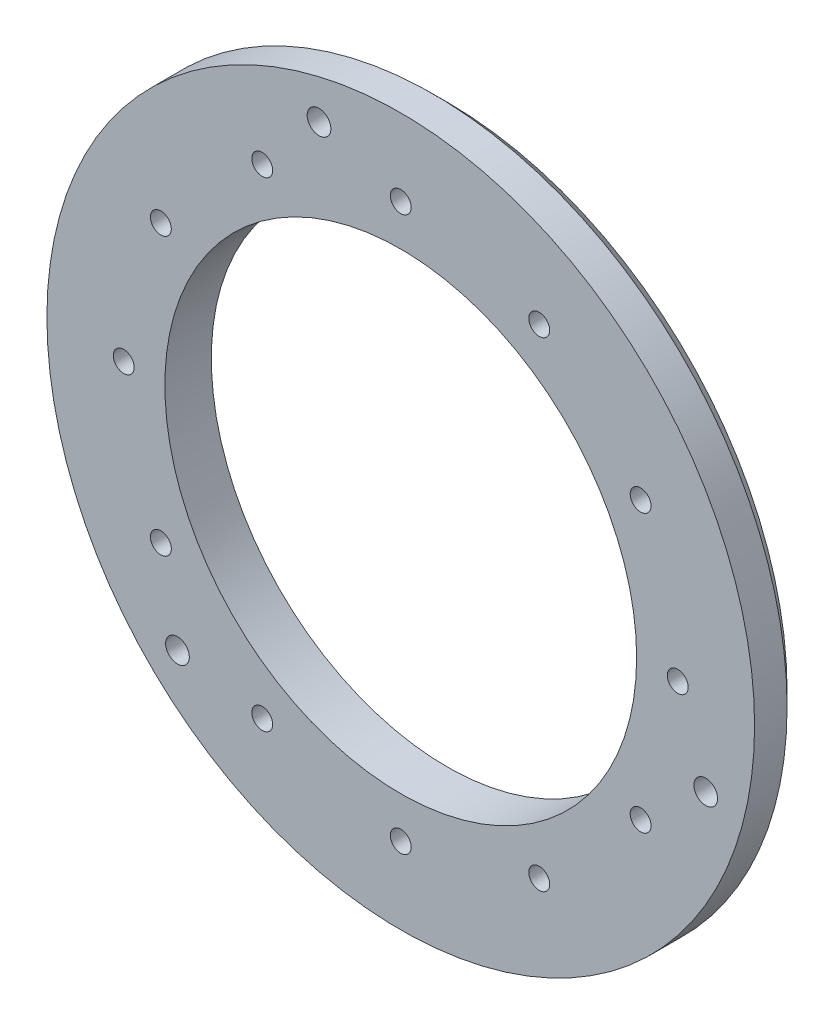
ISO-10303-21;
HEADER;
FILE_DESCRIPTION(('STEP AP214'),'2;1');
FILE_NAME('part.step','',(''),(''),'','','');
FILE_SCHEMA(('AUTOMOTIVE_DESIGN { 1 0 10303 214 1 1 1 1 }'));
ENDSEC;
DATA;
#1=APPLICATION_CONTEXT('core data for automotive mechanical design processes');
#2=APPLICATION_PROTOCOL_DEFINITION('international standard','automotive_design',2000,#1);
#3=PRODUCT_CONTEXT('',#1,'mechanical');
#4=PRODUCT('Part','Part','',(#3));
#5=PRODUCT_RELATED_PRODUCT_CATEGORY('part','',(#4));
#6=PRODUCT_DEFINITION_FORMATION('','',#4);
#7=PRODUCT_DEFINITION_CONTEXT('part definition',#1,'design');
#8=PRODUCT_DEFINITION('design','',#6,#7);
#9=PRODUCT_DEFINITION_SHAPE('','',#8);
#10=(LENGTH_UNIT() NAMED_UNIT(*) SI_UNIT(.MILLI.,.METRE.));
#11=(NAMED_UNIT(*) PLANE_ANGLE_UNIT() SI_UNIT($,.RADIAN.));
#12=(NAMED_UNIT(*) SI_UNIT($,.STERADIAN.) SOLID_ANGLE_UNIT());
#13=UNCERTAINTY_MEASURE_WITH_UNIT(LENGTH_MEASURE(1.E-05),#10,'distance_accuracy_value','');
#14=(GEOMETRIC_REPRESENTATION_CONTEXT(3) GLOBAL_UNCERTAINTY_ASSIGNED_CONTEXT((#13)) GLOBAL_UNIT_ASSIGNED_CONTEXT((#10,
#11,#12)) REPRESENTATION_CONTEXT('',''));
#15=CARTESIAN_POINT('',(0.,0.,0.));
#16=DIRECTION('',(0.,0.,1.));
#17=DIRECTION('',(1.,0.,0.));
#18=AXIS2_PLACEMENT_3D('',#15,#16,#17);
#19=CARTESIAN_POINT('',(0.,0.,10.));
#20=DIRECTION('',(0.,0.,1.));
#21=DIRECTION('',(1.,0.,0.));
#22=AXIS2_PLACEMENT_3D('',#19,#20,#21);
#23=PLANE('',#22);
#24=CARTESIAN_POINT('',(-48.0832611206856,-48.083261120685,10.));
#25=DIRECTION('',(0.,0.,-1.));
#26=DIRECTION('',(-1.,0.,0.));
#27=AXIS2_PLACEMENT_3D('',#24,#25,#26);
#28=CIRCLE('',#27,2.5527);
#29=CARTESIAN_POINT('',(-50.6359611206856,-48.083261120685,10.));
#30=VERTEX_POINT('',#29);
#31=EDGE_CURVE('E143',#30,#30,#28,.T.);
#32=ORIENTED_EDGE('',*,*,#31,.T.);
#33=EDGE_LOOP('',(#32));
#34=FACE_BOUND('',#33,.T.);
#35=CARTESIAN_POINT('',(65.6829561876565,-17.5996950669718,10.));
#36=DIRECTION('',(0.,0.,-1.));
#37=DIRECTION('',(-1.,0.,0.));
#38=AXIS2_PLACEMENT_3D('',#35,#36,#37);
#39=CIRCLE('',#38,2.55269999999999);
#40=CARTESIAN_POINT('',(63.1302561876566,-17.5996950669718,10.));
#41=VERTEX_POINT('',#40);
#42=EDGE_CURVE('E134',#41,#41,#39,.T.);
#43=ORIENTED_EDGE('',*,*,#42,.T.);
#44=EDGE_LOOP('',(#43));
#45=FACE_BOUND('',#44,.T.);
#46=CARTESIAN_POINT('',(-17.599695066971,65.6829561876568,10.));
#47=DIRECTION('',(0.,0.,-1.));
#48=DIRECTION('',(-1.,0.,0.));
#49=AXIS2_PLACEMENT_3D('',#46,#47,#48);
#50=CIRCLE('',#49,2.5527);
#51=CARTESIAN_POINT('',(-20.152395066971,65.6829561876568,10.));
#52=VERTEX_POINT('',#51);
#53=EDGE_CURVE('E125',#52,#52,#50,.T.);
#54=ORIENTED_EDGE('',*,*,#53,.T.);
#55=EDGE_LOOP('',(#54));
#56=FACE_BOUND('',#55,.T.);
#57=CARTESIAN_POINT('',(3.6949610038306E-13,59.65,10.));
#58=DIRECTION('',(0.,0.,-1.));
#59=DIRECTION('',(-1.,0.,0.));
#60=AXIS2_PLACEMENT_3D('',#57,#58,#59);
#61=CIRCLE('',#60,2.2479);
#62=CARTESIAN_POINT('',(-2.24789999999963,59.65,10.));
#63=VERTEX_POINT('',#62);
#64=EDGE_CURVE('E119',#63,#63,#61,.T.);
#65=ORIENTED_EDGE('',*,*,#64,.T.);
#66=EDGE_LOOP('',(#65));
#67=FACE_BOUND('',#66,.T.);
#68=CARTESIAN_POINT('',(-51.6584153357416,29.8250000000003,10.));
#69=DIRECTION('',(0.,0.,-1.));
#70=DIRECTION('',(-1.,0.,0.));
#71=AXIS2_PLACEMENT_3D('',#68,#69,#70);
#72=CIRCLE('',#71,2.2479);
#73=CARTESIAN_POINT('',(-53.9063153357416,29.8250000000003,10.));
#74=VERTEX_POINT('',#73);
#75=EDGE_CURVE('E113',#74,#74,#72,.T.);
#76=ORIENTED_EDGE('',*,*,#75,.T.);
#77=EDGE_LOOP('',(#76));
#78=FACE_BOUND('',#77,.T.);
#79=CARTESIAN_POINT('',(-29.8249999999997,51.6584153357419,10.));
#80=DIRECTION('',(0.,0.,-1.));
#81=DIRECTION('',(-1.,0.,0.));
#82=AXIS2_PLACEMENT_3D('',#79,#80,#81);
#83=CIRCLE('',#82,2.2479);
#84=CARTESIAN_POINT('',(-32.0728999999997,51.6584153357419,10.));
#85=VERTEX_POINT('',#84);
#86=EDGE_CURVE('E107',#85,#85,#83,.T.);
#87=ORIENTED_EDGE('',*,*,#86,.T.);
#88=EDGE_LOOP('',(#87));
#89=FACE_BOUND('',#88,.T.);
#90=CARTESIAN_POINT('',(-59.65,3.33066907387547E-13,10.));
#91=DIRECTION('',(0.,0.,-1.));
#92=DIRECTION('',(-1.,0.,0.));
#93=AXIS2_PLACEMENT_3D('',#90,#91,#92);
#94=CIRCLE('',#93,2.2479);
#95=CARTESIAN_POINT('',(-61.8979,3.33066907387547E-13,10.));
#96=VERTEX_POINT('',#95);
#97=EDGE_CURVE('E101',#96,#96,#94,.T.);
#98=ORIENTED_EDGE('',*,*,#97,.T.);
#99=EDGE_LOOP('',(#98));
#100=FACE_BOUND('',#99,.T.);
#101=CARTESIAN_POINT('',(-51.658415335742,-29.8249999999997,10.));
#102=DIRECTION('',(0.,0.,-1.));
#103=DIRECTION('',(-1.,0.,0.));
#104=AXIS2_PLACEMENT_3D('',#101,#102,#103);
#105=CIRCLE('',#104,2.2479);
#106=CARTESIAN_POINT('',(-53.906315335742,-29.8249999999997,10.));
#107=VERTEX_POINT('',#106);
#108=EDGE_CURVE('E95',#107,#107,#105,.T.);
#109=ORIENTED_EDGE('',*,*,#108,.T.);
#110=EDGE_LOOP('',(#109));
#111=FACE_BOUND('',#110,.T.);
#112=CARTESIAN_POINT('',(-29.8250000000004,-51.6584153357416,10.));
#113=DIRECTION('',(0.,0.,-1.));
#114=DIRECTION('',(-1.,0.,0.));
#115=AXIS2_PLACEMENT_3D('',#112,#113,#114);
#116=CIRCLE('',#115,2.2479);
#117=CARTESIAN_POINT('',(-32.0729000000003,-51.6584153357416,10.));
#118=VERTEX_POINT('',#117);
#119=EDGE_CURVE('E89',#118,#118,#116,.T.);
#120=ORIENTED_EDGE('',*,*,#119,.T.);
#121=EDGE_LOOP('',(#120));
#122=FACE_BOUND('',#121,.T.);
#123=CARTESIAN_POINT('',(-3.7470027081099E-13,-59.6500000000001,10.));
#124=DIRECTION('',(0.,0.,-1.));
#125=DIRECTION('',(-1.,0.,0.));
#126=AXIS2_PLACEMENT_3D('',#123,#124,#125);
#127=CIRCLE('',#126,2.2479);
#128=CARTESIAN_POINT('',(-2.24790000000037,-59.6500000000001,10.));
#129=VERTEX_POINT('',#128);
#130=EDGE_CURVE('E83',#129,#129,#127,.T.);
#131=ORIENTED_EDGE('',*,*,#130,.T.);
#132=EDGE_LOOP('',(#131));
#133=FACE_BOUND('',#132,.T.);
#134=CARTESIAN_POINT('',(29.8249999999997,-51.658415335742,10.));
#135=DIRECTION('',(0.,0.,-1.));
#136=DIRECTION('',(-1.,0.,0.));
#137=AXIS2_PLACEMENT_3D('',#134,#135,#136);
#138=CIRCLE('',#137,2.2479);
#139=CARTESIAN_POINT('',(27.5770999999997,-51.658415335742,10.));
#140=VERTEX_POINT('',#139);
#141=EDGE_CURVE('E77',#140,#140,#138,.T.);
#142=ORIENTED_EDGE('',*,*,#141,.T.);
#143=EDGE_LOOP('',(#142));
#144=FACE_BOUND('',#143,.T.);
#145=CARTESIAN_POINT('',(51.6584153357416,-29.8250000000004,10.));
#146=DIRECTION('',(0.,0.,-1.));
#147=DIRECTION('',(-1.,0.,0.));
#148=AXIS2_PLACEMENT_3D('',#145,#146,#147);
#149=CIRCLE('',#148,2.2479);
#150=CARTESIAN_POINT('',(49.4105153357416,-29.8250000000004,10.));
#151=VERTEX_POINT('',#150);
#152=EDGE_CURVE('E71',#151,#151,#149,.T.);
#153=ORIENTED_EDGE('',*,*,#152,.T.);
#154=EDGE_LOOP('',(#153));
#155=FACE_BOUND('',#154,.T.);
#156=CARTESIAN_POINT('',(59.65,-4.16333634234434E-13,10.));
#157=DIRECTION('',(0.,0.,-1.));
#158=DIRECTION('',(-1.,0.,0.));
#159=AXIS2_PLACEMENT_3D('',#156,#157,#158);
#160=CIRCLE('',#159,2.2479);
#161=CARTESIAN_POINT('',(57.4021,-4.16333634234434E-13,10.));
#162=VERTEX_POINT('',#161);
#163=EDGE_CURVE('E65',#162,#162,#160,.T.);
#164=ORIENTED_EDGE('',*,*,#163,.T.);
#165=EDGE_LOOP('',(#164));
#166=FACE_BOUND('',#165,.T.);
#167=CARTESIAN_POINT('',(51.658415335742,29.8249999999996,10.));
#168=DIRECTION('',(0.,0.,-1.));
#169=DIRECTION('',(-1.,0.,0.));
#170=AXIS2_PLACEMENT_3D('',#167,#168,#169);
#171=CIRCLE('',#170,2.2479);
#172=CARTESIAN_POINT('',(49.410515335742,29.8249999999996,10.));
#173=VERTEX_POINT('',#172);
#174=EDGE_CURVE('E59',#173,#173,#171,.T.);
#175=ORIENTED_EDGE('',*,*,#174,.T.);
#176=EDGE_LOOP('',(#175));
#177=FACE_BOUND('',#176,.T.);
#178=CARTESIAN_POINT('',(0.,0.,10.));
#179=DIRECTION('',(0.,0.,1.));
#180=DIRECTION('',(1.,0.,0.));
#181=AXIS2_PLACEMENT_3D('',#178,#179,#180);
#182=CIRCLE('',#181,50.8);
#183=CARTESIAN_POINT('',(50.8,0.,10.));
#184=VERTEX_POINT('',#183);
#185=EDGE_CURVE('E45',#184,#184,#182,.T.);
#186=ORIENTED_EDGE('',*,*,#185,.F.);
#187=EDGE_LOOP('',(#186));
#188=FACE_BOUND('',#187,.T.);
#189=CARTESIAN_POINT('',(0.,0.,10.));
#190=DIRECTION('',(0.,0.,1.));
#191=DIRECTION('',(1.,0.,0.));
#192=AXIS2_PLACEMENT_3D('',#189,#190,#191);
#193=CIRCLE('',#192,76.2);
#194=CARTESIAN_POINT('',(76.2,0.,10.));
#195=VERTEX_POINT('',#194);
#196=EDGE_CURVE('E41',#195,#195,#193,.T.);
#197=ORIENTED_EDGE('',*,*,#196,.T.);
#198=EDGE_LOOP('',(#197));
#199=FACE_BOUND('',#198,.T.);
#200=CARTESIAN_POINT('',(29.8250000000003,51.6584153357416,10.));
#201=DIRECTION('',(0.,0.,-1.));
#202=DIRECTION('',(-1.,0.,0.));
#203=AXIS2_PLACEMENT_3D('',#200,#201,#202);
#204=CIRCLE('',#203,2.2479);
#205=CARTESIAN_POINT('',(27.5771000000003,51.6584153357416,10.));
#206=VERTEX_POINT('',#205);
#207=EDGE_CURVE('E51',#206,#206,#204,.T.);
#208=ORIENTED_EDGE('',*,*,#207,.T.);
#209=EDGE_LOOP('',(#208));
#210=FACE_BOUND('',#209,.T.);
#211=ADVANCED_FACE('F30',(#34,#45,#56,#67,#78,#89,#100,#111,#122,#133,#144,#155,#166,#177,#188,
#199,#210),#23,.T.);
#212=CARTESIAN_POINT('',(0.,0.,0.));
#213=DIRECTION('',(0.,0.,1.));
#214=DIRECTION('',(1.,0.,0.));
#215=AXIS2_PLACEMENT_3D('',#212,#213,#214);
#216=PLANE('',#215);
#217=CARTESIAN_POINT('',(-48.0832611206856,-48.083261120685,0.));
#218=DIRECTION('',(0.,0.,-1.));
#219=DIRECTION('',(-1.,0.,0.));
#220=AXIS2_PLACEMENT_3D('',#217,#218,#219);
#221=CIRCLE('',#220,4.8895);
#222=CARTESIAN_POINT('',(-52.9727611206856,-48.083261120685,0.));
#223=VERTEX_POINT('',#222);
#224=EDGE_CURVE('E149',#223,#223,#221,.T.);
#225=ORIENTED_EDGE('',*,*,#224,.F.);
#226=EDGE_LOOP('',(#225));
#227=FACE_BOUND('',#226,.T.);
#228=CARTESIAN_POINT('',(65.6829561876565,-17.5996950669718,0.));
#229=DIRECTION('',(0.,0.,-1.));
#230=DIRECTION('',(-1.,0.,0.));
#231=AXIS2_PLACEMENT_3D('',#228,#229,#230);
#232=CIRCLE('',#231,4.88950000000001);
#233=CARTESIAN_POINT('',(60.7934561876565,-17.5996950669718,0.));
#234=VERTEX_POINT('',#233);
#235=EDGE_CURVE('E140',#234,#234,#232,.T.);
#236=ORIENTED_EDGE('',*,*,#235,.F.);
#237=EDGE_LOOP('',(#236));
#238=FACE_BOUND('',#237,.T.);
#239=CARTESIAN_POINT('',(-17.599695066971,65.6829561876568,0.));
#240=DIRECTION('',(0.,0.,-1.));
#241=DIRECTION('',(-1.,0.,0.));
#242=AXIS2_PLACEMENT_3D('',#239,#240,#241);
#243=CIRCLE('',#242,4.8895);
#244=CARTESIAN_POINT('',(-22.489195066971,65.6829561876568,0.));
#245=VERTEX_POINT('',#244);
#246=EDGE_CURVE('E131',#245,#245,#243,.T.);
#247=ORIENTED_EDGE('',*,*,#246,.F.);
#248=EDGE_LOOP('',(#247));
#249=FACE_BOUND('',#248,.T.);
#250=CARTESIAN_POINT('',(3.6949610038306E-13,59.65,0.));
#251=DIRECTION('',(0.,0.,-1.));
#252=DIRECTION('',(-1.,0.,0.));
#253=AXIS2_PLACEMENT_3D('',#250,#251,#252);
#254=CIRCLE('',#253,2.2479);
#255=CARTESIAN_POINT('',(-2.24789999999963,59.65,0.));
#256=VERTEX_POINT('',#255);
#257=EDGE_CURVE('E122',#256,#256,#254,.T.);
#258=ORIENTED_EDGE('',*,*,#257,.F.);
#259=EDGE_LOOP('',(#258));
#260=FACE_BOUND('',#259,.T.);
#261=CARTESIAN_POINT('',(-51.6584153357416,29.8250000000003,0.));
#262=DIRECTION('',(0.,0.,-1.));
#263=DIRECTION('',(-1.,0.,0.));
#264=AXIS2_PLACEMENT_3D('',#261,#262,#263);
#265=CIRCLE('',#264,2.2479);
#266=CARTESIAN_POINT('',(-53.9063153357416,29.8250000000003,0.));
#267=VERTEX_POINT('',#266);
#268=EDGE_CURVE('E116',#267,#267,#265,.T.);
#269=ORIENTED_EDGE('',*,*,#268,.F.);
#270=EDGE_LOOP('',(#269));
#271=FACE_BOUND('',#270,.T.);
#272=CARTESIAN_POINT('',(-29.8249999999997,51.6584153357419,0.));
#273=DIRECTION('',(0.,0.,-1.));
#274=DIRECTION('',(-1.,0.,0.));
#275=AXIS2_PLACEMENT_3D('',#272,#273,#274);
#276=CIRCLE('',#275,2.2479);
#277=CARTESIAN_POINT('',(-32.0728999999997,51.6584153357419,0.));
#278=VERTEX_POINT('',#277);
#279=EDGE_CURVE('E110',#278,#278,#276,.T.);
#280=ORIENTED_EDGE('',*,*,#279,.F.);
#281=EDGE_LOOP('',(#280));
#282=FACE_BOUND('',#281,.T.);
#283=CARTESIAN_POINT('',(-59.65,3.33066907387547E-13,0.));
#284=DIRECTION('',(0.,0.,-1.));
#285=DIRECTION('',(-1.,0.,0.));
#286=AXIS2_PLACEMENT_3D('',#283,#284,#285);
#287=CIRCLE('',#286,2.2479);
#288=CARTESIAN_POINT('',(-61.8979,3.33066907387547E-13,0.));
#289=VERTEX_POINT('',#288);
#290=EDGE_CURVE('E104',#289,#289,#287,.T.);
#291=ORIENTED_EDGE('',*,*,#290,.F.);
#292=EDGE_LOOP('',(#291));
#293=FACE_BOUND('',#292,.T.);
#294=CARTESIAN_POINT('',(-51.658415335742,-29.8249999999997,0.));
#295=DIRECTION('',(0.,0.,-1.));
#296=DIRECTION('',(-1.,0.,0.));
#297=AXIS2_PLACEMENT_3D('',#294,#295,#296);
#298=CIRCLE('',#297,2.2479);
#299=CARTESIAN_POINT('',(-53.906315335742,-29.8249999999997,0.));
#300=VERTEX_POINT('',#299);
#301=EDGE_CURVE('E98',#300,#300,#298,.T.);
#302=ORIENTED_EDGE('',*,*,#301,.F.);
#303=EDGE_LOOP('',(#302));
#304=FACE_BOUND('',#303,.T.);
#305=CARTESIAN_POINT('',(-29.8250000000004,-51.6584153357416,0.));
#306=DIRECTION('',(0.,0.,-1.));
#307=DIRECTION('',(-1.,0.,0.));
#308=AXIS2_PLACEMENT_3D('',#305,#306,#307);
#309=CIRCLE('',#308,2.2479);
#310=CARTESIAN_POINT('',(-32.0729000000003,-51.6584153357416,0.));
#311=VERTEX_POINT('',#310);
#312=EDGE_CURVE('E92',#311,#311,#309,.T.);
#313=ORIENTED_EDGE('',*,*,#312,.F.);
#314=EDGE_LOOP('',(#313));
#315=FACE_BOUND('',#314,.T.);
#316=CARTESIAN_POINT('',(-3.7470027081099E-13,-59.6500000000001,0.));
#317=DIRECTION('',(0.,0.,-1.));
#318=DIRECTION('',(-1.,0.,0.));
#319=AXIS2_PLACEMENT_3D('',#316,#317,#318);
#320=CIRCLE('',#319,2.2479);
#321=CARTESIAN_POINT('',(-2.24790000000037,-59.6500000000001,0.));
#322=VERTEX_POINT('',#321);
#323=EDGE_CURVE('E86',#322,#322,#320,.T.);
#324=ORIENTED_EDGE('',*,*,#323,.F.);
#325=EDGE_LOOP('',(#324));
#326=FACE_BOUND('',#325,.T.);
#327=CARTESIAN_POINT('',(29.8249999999997,-51.658415335742,0.));
#328=DIRECTION('',(0.,0.,-1.));
#329=DIRECTION('',(-1.,0.,0.));
#330=AXIS2_PLACEMENT_3D('',#327,#328,#329);
#331=CIRCLE('',#330,2.2479);
#332=CARTESIAN_POINT('',(27.5770999999997,-51.658415335742,0.));
#333=VERTEX_POINT('',#332);
#334=EDGE_CURVE('E80',#333,#333,#331,.T.);
#335=ORIENTED_EDGE('',*,*,#334,.F.);
#336=EDGE_LOOP('',(#335));
#337=FACE_BOUND('',#336,.T.);
#338=CARTESIAN_POINT('',(51.6584153357416,-29.8250000000004,0.));
#339=DIRECTION('',(0.,0.,-1.));
#340=DIRECTION('',(-1.,0.,0.));
#341=AXIS2_PLACEMENT_3D('',#338,#339,#340);
#342=CIRCLE('',#341,2.2479);
#343=CARTESIAN_POINT('',(49.4105153357416,-29.8250000000004,0.));
#344=VERTEX_POINT('',#343);
#345=EDGE_CURVE('E74',#344,#344,#342,.T.);
#346=ORIENTED_EDGE('',*,*,#345,.F.);
#347=EDGE_LOOP('',(#346));
#348=FACE_BOUND('',#347,.T.);
#349=CARTESIAN_POINT('',(59.65,-4.16333634234434E-13,0.));
#350=DIRECTION('',(0.,0.,-1.));
#351=DIRECTION('',(-1.,0.,0.));
#352=AXIS2_PLACEMENT_3D('',#349,#350,#351);
#353=CIRCLE('',#352,2.2479);
#354=CARTESIAN_POINT('',(57.4021,-4.16333634234434E-13,0.));
#355=VERTEX_POINT('',#354);
#356=EDGE_CURVE('E68',#355,#355,#353,.T.);
#357=ORIENTED_EDGE('',*,*,#356,.F.);
#358=EDGE_LOOP('',(#357));
#359=FACE_BOUND('',#358,.T.);
#360=CARTESIAN_POINT('',(51.658415335742,29.8249999999996,0.));
#361=DIRECTION('',(0.,0.,-1.));
#362=DIRECTION('',(-1.,0.,0.));
#363=AXIS2_PLACEMENT_3D('',#360,#361,#362);
#364=CIRCLE('',#363,2.2479);
#365=CARTESIAN_POINT('',(49.410515335742,29.8249999999996,0.));
#366=VERTEX_POINT('',#365);
#367=EDGE_CURVE('E62',#366,#366,#364,.T.);
#368=ORIENTED_EDGE('',*,*,#367,.F.);
#369=EDGE_LOOP('',(#368));
#370=FACE_BOUND('',#369,.T.);
#371=CARTESIAN_POINT('',(0.,0.,0.));
#372=DIRECTION('',(0.,0.,1.));
#373=DIRECTION('',(1.,0.,0.));
#374=AXIS2_PLACEMENT_3D('',#371,#372,#373);
#375=CIRCLE('',#374,73.2);
#376=CARTESIAN_POINT('',(73.2,0.,0.));
#377=VERTEX_POINT('',#376);
#378=EDGE_CURVE('E10',#377,#377,#375,.F.);
#379=ORIENTED_EDGE('',*,*,#378,.T.);
#380=EDGE_LOOP('',(#379));
#381=FACE_BOUND('',#380,.T.);
#382=CARTESIAN_POINT('',(0.,0.,0.));
#383=DIRECTION('',(0.,0.,1.));
#384=DIRECTION('',(1.,0.,0.));
#385=AXIS2_PLACEMENT_3D('',#382,#383,#384);
#386=CIRCLE('',#385,50.8);
#387=CARTESIAN_POINT('',(50.8,0.,0.));
#388=VERTEX_POINT('',#387);
#389=EDGE_CURVE('E48',#388,#388,#386,.T.);
#390=ORIENTED_EDGE('',*,*,#389,.T.);
#391=EDGE_LOOP('',(#390));
#392=FACE_BOUND('',#391,.T.);
#393=CARTESIAN_POINT('',(29.8250000000003,51.6584153357416,0.));
#394=DIRECTION('',(0.,0.,-1.));
#395=DIRECTION('',(-1.,0.,0.));
#396=AXIS2_PLACEMENT_3D('',#393,#394,#395);
#397=CIRCLE('',#396,2.2479);
#398=CARTESIAN_POINT('',(27.5771000000003,51.6584153357416,0.));
#399=VERTEX_POINT('',#398);
#400=EDGE_CURVE('E56',#399,#399,#397,.T.);
#401=ORIENTED_EDGE('',*,*,#400,.F.);
#402=EDGE_LOOP('',(#401));
#403=FACE_BOUND('',#402,.T.);
#404=ADVANCED_FACE('F155',(#227,#238,#249,#260,#271,#282,#293,#304,#315,#326,#337,#348,#359,
#370,#381,#392,#403),#216,.F.);
#405=CARTESIAN_POINT('',(0.,0.,10.));
#406=DIRECTION('',(0.,0.,-1.));
#407=DIRECTION('',(-1.,0.,0.));
#408=AXIS2_PLACEMENT_3D('',#405,#406,#407);
#409=CYLINDRICAL_SURFACE('',#408,76.2);
#410=CARTESIAN_POINT('',(0.,0.,2.99999999999996));
#411=DIRECTION('',(0.,0.,1.));
#412=DIRECTION('',(1.,0.,0.));
#413=AXIS2_PLACEMENT_3D('',#410,#411,#412);
#414=CIRCLE('',#413,76.2);
#415=CARTESIAN_POINT('',(76.2,0.,2.99999999999996));
#416=VERTEX_POINT('',#415);
#417=EDGE_CURVE('E37',#416,#416,#414,.T.);
#418=ORIENTED_EDGE('',*,*,#417,.T.);
#419=EDGE_LOOP('',(#418));
#420=FACE_BOUND('',#419,.T.);
#421=ORIENTED_EDGE('',*,*,#196,.F.);
#422=EDGE_LOOP('',(#421));
#423=FACE_BOUND('',#422,.T.);
#424=ADVANCED_FACE('F158',(#420,#423),#409,.T.);
#425=CARTESIAN_POINT('',(0.,0.,10.));
#426=DIRECTION('',(0.,0.,-1.));
#427=DIRECTION('',(-1.,0.,0.));
#428=AXIS2_PLACEMENT_3D('',#425,#426,#427);
#429=CYLINDRICAL_SURFACE('',#428,50.8);
#430=ORIENTED_EDGE('',*,*,#185,.T.);
#431=EDGE_LOOP('',(#430));
#432=FACE_BOUND('',#431,.T.);
#433=ORIENTED_EDGE('',*,*,#389,.F.);
#434=EDGE_LOOP('',(#433));
#435=FACE_BOUND('',#434,.T.);
#436=ADVANCED_FACE('F202',(#432,#435),#429,.F.);
#437=CARTESIAN_POINT('',(0.,0.,2.99999999999996));
#438=DIRECTION('',(0.,0.,1.));
#439=DIRECTION('',(1.,0.,0.));
#440=AXIS2_PLACEMENT_3D('',#437,#438,#439);
#441=CONICAL_SURFACE('',#440,76.2,0.785398163397451);
#442=ORIENTED_EDGE('',*,*,#378,.F.);
#443=EDGE_LOOP('',(#442));
#444=FACE_BOUND('',#443,.T.);
#445=ORIENTED_EDGE('',*,*,#417,.F.);
#446=EDGE_LOOP('',(#445));
#447=FACE_BOUND('',#446,.T.);
#448=ADVANCED_FACE('F32',(#444,#447),#441,.T.);
#449=CARTESIAN_POINT('',(29.8250000000003,51.6584153357416,0.));
#450=DIRECTION('',(0.,0.,-1.));
#451=DIRECTION('',(-1.,0.,0.));
#452=AXIS2_PLACEMENT_3D('',#449,#450,#451);
#453=CYLINDRICAL_SURFACE('',#452,2.2479);
#454=ORIENTED_EDGE('',*,*,#207,.F.);
#455=EDGE_LOOP('',(#454));
#456=FACE_BOUND('',#455,.T.);
#457=ORIENTED_EDGE('',*,*,#400,.T.);
#458=EDGE_LOOP('',(#457));
#459=FACE_BOUND('',#458,.T.);
#460=ADVANCED_FACE('F190',(#456,#459),#453,.F.);
#461=CARTESIAN_POINT('',(51.658415335742,29.8249999999996,0.));
#462=DIRECTION('',(0.,0.,-1.));
#463=DIRECTION('',(-1.,0.,0.));
#464=AXIS2_PLACEMENT_3D('',#461,#462,#463);
#465=CYLINDRICAL_SURFACE('',#464,2.2479);
#466=ORIENTED_EDGE('',*,*,#174,.F.);
#467=EDGE_LOOP('',(#466));
#468=FACE_BOUND('',#467,.T.);
#469=ORIENTED_EDGE('',*,*,#367,.T.);
#470=EDGE_LOOP('',(#469));
#471=FACE_BOUND('',#470,.T.);
#472=ADVANCED_FACE('F192',(#468,#471),#465,.F.);
#473=CARTESIAN_POINT('',(59.65,-4.16333634234434E-13,0.));
#474=DIRECTION('',(0.,0.,-1.));
#475=DIRECTION('',(-1.,0.,0.));
#476=AXIS2_PLACEMENT_3D('',#473,#474,#475);
#477=CYLINDRICAL_SURFACE('',#476,2.2479);
#478=ORIENTED_EDGE('',*,*,#163,.F.);
#479=EDGE_LOOP('',(#478));
#480=FACE_BOUND('',#479,.T.);
#481=ORIENTED_EDGE('',*,*,#356,.T.);
#482=EDGE_LOOP('',(#481));
#483=FACE_BOUND('',#482,.T.);
#484=ADVANCED_FACE('F199',(#480,#483),#477,.F.);
#485=CARTESIAN_POINT('',(51.6584153357416,-29.8250000000004,0.));
#486=DIRECTION('',(0.,0.,-1.));
#487=DIRECTION('',(-1.,0.,0.));
#488=AXIS2_PLACEMENT_3D('',#485,#486,#487);
#489=CYLINDRICAL_SURFACE('',#488,2.2479);
#490=ORIENTED_EDGE('',*,*,#152,.F.);
#491=EDGE_LOOP('',(#490));
#492=FACE_BOUND('',#491,.T.);
#493=ORIENTED_EDGE('',*,*,#345,.T.);
#494=EDGE_LOOP('',(#493));
#495=FACE_BOUND('',#494,.T.);
#496=ADVANCED_FACE('F253',(#492,#495),#489,.F.);
#497=CARTESIAN_POINT('',(29.8249999999997,-51.658415335742,0.));
#498=DIRECTION('',(0.,0.,-1.));
#499=DIRECTION('',(-1.,0.,0.));
#500=AXIS2_PLACEMENT_3D('',#497,#498,#499);
#501=CYLINDRICAL_SURFACE('',#500,2.2479);
#502=ORIENTED_EDGE('',*,*,#141,.F.);
#503=EDGE_LOOP('',(#502));
#504=FACE_BOUND('',#503,.T.);
#505=ORIENTED_EDGE('',*,*,#334,.T.);
#506=EDGE_LOOP('',(#505));
#507=FACE_BOUND('',#506,.T.);
#508=ADVANCED_FACE('F263',(#504,#507),#501,.F.);
#509=CARTESIAN_POINT('',(-3.7470027081099E-13,-59.6500000000001,0.));
#510=DIRECTION('',(0.,0.,-1.));
#511=DIRECTION('',(-1.,0.,0.));
#512=AXIS2_PLACEMENT_3D('',#509,#510,#511);
#513=CYLINDRICAL_SURFACE('',#512,2.2479);
#514=ORIENTED_EDGE('',*,*,#130,.F.);
#515=EDGE_LOOP('',(#514));
#516=FACE_BOUND('',#515,.T.);
#517=ORIENTED_EDGE('',*,*,#323,.T.);
#518=EDGE_LOOP('',(#517));
#519=FACE_BOUND('',#518,.T.);
#520=ADVANCED_FACE('F273',(#516,#519),#513,.F.);
#521=CARTESIAN_POINT('',(-29.8250000000004,-51.6584153357416,0.));
#522=DIRECTION('',(0.,0.,-1.));
#523=DIRECTION('',(-1.,0.,0.));
#524=AXIS2_PLACEMENT_3D('',#521,#522,#523);
#525=CYLINDRICAL_SURFACE('',#524,2.2479);
#526=ORIENTED_EDGE('',*,*,#119,.F.);
#527=EDGE_LOOP('',(#526));
#528=FACE_BOUND('',#527,.T.);
#529=ORIENTED_EDGE('',*,*,#312,.T.);
#530=EDGE_LOOP('',(#529));
#531=FACE_BOUND('',#530,.T.);
#532=ADVANCED_FACE('F283',(#528,#531),#525,.F.);
#533=CARTESIAN_POINT('',(-51.658415335742,-29.8249999999997,0.));
#534=DIRECTION('',(0.,0.,-1.));
#535=DIRECTION('',(-1.,0.,0.));
#536=AXIS2_PLACEMENT_3D('',#533,#534,#535);
#537=CYLINDRICAL_SURFACE('',#536,2.2479);
#538=ORIENTED_EDGE('',*,*,#108,.F.);
#539=EDGE_LOOP('',(#538));
#540=FACE_BOUND('',#539,.T.);
#541=ORIENTED_EDGE('',*,*,#301,.T.);
#542=EDGE_LOOP('',(#541));
#543=FACE_BOUND('',#542,.T.);
#544=ADVANCED_FACE('F293',(#540,#543),#537,.F.);
#545=CARTESIAN_POINT('',(-59.65,3.33066907387547E-13,0.));
#546=DIRECTION('',(0.,0.,-1.));
#547=DIRECTION('',(-1.,0.,0.));
#548=AXIS2_PLACEMENT_3D('',#545,#546,#547);
#549=CYLINDRICAL_SURFACE('',#548,2.2479);
#550=ORIENTED_EDGE('',*,*,#97,.F.);
#551=EDGE_LOOP('',(#550));
#552=FACE_BOUND('',#551,.T.);
#553=ORIENTED_EDGE('',*,*,#290,.T.);
#554=EDGE_LOOP('',(#553));
#555=FACE_BOUND('',#554,.T.);
#556=ADVANCED_FACE('F303',(#552,#555),#549,.F.);
#557=CARTESIAN_POINT('',(-29.8249999999997,51.6584153357419,0.));
#558=DIRECTION('',(0.,0.,-1.));
#559=DIRECTION('',(-1.,0.,0.));
#560=AXIS2_PLACEMENT_3D('',#557,#558,#559);
#561=CYLINDRICAL_SURFACE('',#560,2.2479);
#562=ORIENTED_EDGE('',*,*,#86,.F.);
#563=EDGE_LOOP('',(#562));
#564=FACE_BOUND('',#563,.T.);
#565=ORIENTED_EDGE('',*,*,#279,.T.);
#566=EDGE_LOOP('',(#565));
#567=FACE_BOUND('',#566,.T.);
#568=ADVANCED_FACE('F313',(#564,#567),#561,.F.);
#569=CARTESIAN_POINT('',(-51.6584153357416,29.8250000000003,0.));
#570=DIRECTION('',(0.,0.,-1.));
#571=DIRECTION('',(-1.,0.,0.));
#572=AXIS2_PLACEMENT_3D('',#569,#570,#571);
#573=CYLINDRICAL_SURFACE('',#572,2.2479);
#574=ORIENTED_EDGE('',*,*,#75,.F.);
#575=EDGE_LOOP('',(#574));
#576=FACE_BOUND('',#575,.T.);
#577=ORIENTED_EDGE('',*,*,#268,.T.);
#578=EDGE_LOOP('',(#577));
#579=FACE_BOUND('',#578,.T.);
#580=ADVANCED_FACE('F323',(#576,#579),#573,.F.);
#581=CARTESIAN_POINT('',(3.6949610038306E-13,59.65,0.));
#582=DIRECTION('',(0.,0.,-1.));
#583=DIRECTION('',(-1.,0.,0.));
#584=AXIS2_PLACEMENT_3D('',#581,#582,#583);
#585=CYLINDRICAL_SURFACE('',#584,2.2479);
#586=ORIENTED_EDGE('',*,*,#64,.F.);
#587=EDGE_LOOP('',(#586));
#588=FACE_BOUND('',#587,.T.);
#589=ORIENTED_EDGE('',*,*,#257,.T.);
#590=EDGE_LOOP('',(#589));
#591=FACE_BOUND('',#590,.T.);
#592=ADVANCED_FACE('F333',(#588,#591),#585,.F.);
#593=CARTESIAN_POINT('',(-17.599695066971,65.6829561876568,0.));
#594=DIRECTION('',(0.,0.,-1.));
#595=DIRECTION('',(-1.,0.,0.));
#596=AXIS2_PLACEMENT_3D('',#593,#594,#595);
#597=CYLINDRICAL_SURFACE('',#596,2.5527);
#598=ORIENTED_EDGE('',*,*,#53,.F.);
#599=EDGE_LOOP('',(#598));
#600=FACE_BOUND('',#599,.T.);
#601=CARTESIAN_POINT('',(-17.599695066971,65.6829561876568,2.68818089399405));
#602=DIRECTION('',(0.,0.,-1.));
#603=DIRECTION('',(-1.,0.,0.));
#604=AXIS2_PLACEMENT_3D('',#601,#602,#603);
#605=CIRCLE('',#604,2.5527);
#606=CARTESIAN_POINT('',(-20.152395066971,65.6829561876568,2.68818089399405));
#607=VERTEX_POINT('',#606);
#608=EDGE_CURVE('E128',#607,#607,#605,.T.);
#609=ORIENTED_EDGE('',*,*,#608,.T.);
#610=EDGE_LOOP('',(#609));
#611=FACE_BOUND('',#610,.T.);
#612=ADVANCED_FACE('F342',(#600,#611),#597,.F.);
#613=CARTESIAN_POINT('',(-17.599695066971,65.6829561876568,0.));
#614=DIRECTION('',(0.,0.,-1.));
#615=DIRECTION('',(-1.,0.,0.));
#616=AXIS2_PLACEMENT_3D('',#613,#614,#615);
#617=CONICAL_SURFACE('',#616,4.8895,0.715584993317676);
#618=ORIENTED_EDGE('',*,*,#608,.F.);
#619=EDGE_LOOP('',(#618));
#620=FACE_BOUND('',#619,.T.);
#621=ORIENTED_EDGE('',*,*,#246,.T.);
#622=EDGE_LOOP('',(#621));
#623=FACE_BOUND('',#622,.T.);
#624=ADVANCED_FACE('F361',(#620,#623),#617,.F.);
#625=CARTESIAN_POINT('',(65.6829561876565,-17.5996950669718,0.));
#626=DIRECTION('',(0.,0.,-1.));
#627=DIRECTION('',(-1.,0.,0.));
#628=AXIS2_PLACEMENT_3D('',#625,#626,#627);
#629=CYLINDRICAL_SURFACE('',#628,2.5527);
#630=ORIENTED_EDGE('',*,*,#42,.F.);
#631=EDGE_LOOP('',(#630));
#632=FACE_BOUND('',#631,.T.);
#633=CARTESIAN_POINT('',(65.6829561876565,-17.5996950669718,2.68818089399405));
#634=DIRECTION('',(0.,0.,-1.));
#635=DIRECTION('',(-1.,0.,0.));
#636=AXIS2_PLACEMENT_3D('',#633,#634,#635);
#637=CIRCLE('',#636,2.55270000000001);
#638=CARTESIAN_POINT('',(63.1302561876565,-17.5996950669718,2.68818089399405));
#639=VERTEX_POINT('',#638);
#640=EDGE_CURVE('E137',#639,#639,#637,.T.);
#641=ORIENTED_EDGE('',*,*,#640,.T.);
#642=EDGE_LOOP('',(#641));
#643=FACE_BOUND('',#642,.T.);
#644=ADVANCED_FACE('F371',(#632,#643),#629,.F.);
#645=CARTESIAN_POINT('',(65.6829561876565,-17.5996950669718,0.));
#646=DIRECTION('',(0.,0.,-1.));
#647=DIRECTION('',(-1.,0.,0.));
#648=AXIS2_PLACEMENT_3D('',#645,#646,#647);
#649=CONICAL_SURFACE('',#648,4.88950000000001,0.715584993317675);
#650=ORIENTED_EDGE('',*,*,#640,.F.);
#651=EDGE_LOOP('',(#650));
#652=FACE_BOUND('',#651,.T.);
#653=ORIENTED_EDGE('',*,*,#235,.T.);
#654=EDGE_LOOP('',(#653));
#655=FACE_BOUND('',#654,.T.);
#656=ADVANCED_FACE('F381',(#652,#655),#649,.F.);
#657=CARTESIAN_POINT('',(-48.0832611206856,-48.083261120685,0.));
#658=DIRECTION('',(0.,0.,-1.));
#659=DIRECTION('',(-1.,0.,0.));
#660=AXIS2_PLACEMENT_3D('',#657,#658,#659);
#661=CYLINDRICAL_SURFACE('',#660,2.5527);
#662=ORIENTED_EDGE('',*,*,#31,.F.);
#663=EDGE_LOOP('',(#662));
#664=FACE_BOUND('',#663,.T.);
#665=CARTESIAN_POINT('',(-48.0832611206856,-48.083261120685,2.68818089399405));
#666=DIRECTION('',(0.,0.,-1.));
#667=DIRECTION('',(-1.,0.,0.));
#668=AXIS2_PLACEMENT_3D('',#665,#666,#667);
#669=CIRCLE('',#668,2.5527);
#670=CARTESIAN_POINT('',(-50.6359611206856,-48.083261120685,2.68818089399405));
#671=VERTEX_POINT('',#670);
#672=EDGE_CURVE('E146',#671,#671,#669,.T.);
#673=ORIENTED_EDGE('',*,*,#672,.T.);
#674=EDGE_LOOP('',(#673));
#675=FACE_BOUND('',#674,.T.);
#676=ADVANCED_FACE('F391',(#664,#675),#661,.F.);
#677=CARTESIAN_POINT('',(-48.0832611206856,-48.083261120685,0.));
#678=DIRECTION('',(0.,0.,-1.));
#679=DIRECTION('',(-1.,0.,0.));
#680=AXIS2_PLACEMENT_3D('',#677,#678,#679);
#681=CONICAL_SURFACE('',#680,4.8895,0.715584993317675);
#682=ORIENTED_EDGE('',*,*,#672,.F.);
#683=EDGE_LOOP('',(#682));
#684=FACE_BOUND('',#683,.T.);
#685=ORIENTED_EDGE('',*,*,#224,.T.);
#686=EDGE_LOOP('',(#685));
#687=FACE_BOUND('',#686,.T.);
#688=ADVANCED_FACE('F153',(#684,#687),#681,.F.);
#689=CLOSED_SHELL('',(#211,#404,#424,#436,#448,#460,#472,#484,#496,#508,#520,#532,#544,#556,
#568,#580,#592,#612,#624,#644,#656,#676,#688));
#690=MANIFOLD_SOLID_BREP('B2',#689);
#691=ADVANCED_BREP_SHAPE_REPRESENTATION('',(#18,#690),#14);
#692=SHAPE_DEFINITION_REPRESENTATION(#9,#691);
ENDSEC;
END-ISO-10303-21;
